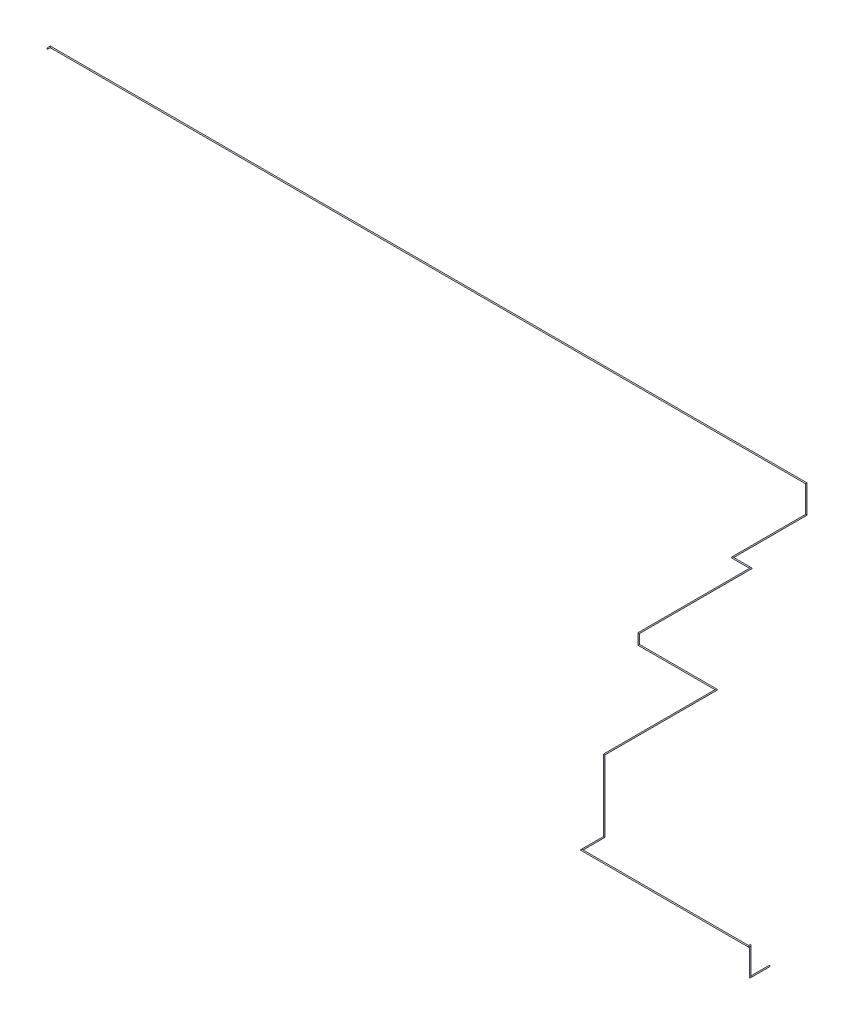
ISO-10303-21;
HEADER;
FILE_DESCRIPTION(('STEP AP214'),'2;1');
FILE_NAME('part.step','',(''),(''),'','','');
FILE_SCHEMA(('AUTOMOTIVE_DESIGN { 1 0 10303 214 1 1 1 1 }'));
ENDSEC;
DATA;
#1=APPLICATION_CONTEXT('core data for automotive mechanical design processes');
#2=APPLICATION_PROTOCOL_DEFINITION('international standard','automotive_design',2000,#1);
#3=PRODUCT_CONTEXT('',#1,'mechanical');
#4=PRODUCT('Part','Part','',(#3));
#5=PRODUCT_RELATED_PRODUCT_CATEGORY('part','',(#4));
#6=PRODUCT_DEFINITION_FORMATION('','',#4);
#7=PRODUCT_DEFINITION_CONTEXT('part definition',#1,'design');
#8=PRODUCT_DEFINITION('design','',#6,#7);
#9=PRODUCT_DEFINITION_SHAPE('','',#8);
#10=(LENGTH_UNIT() NAMED_UNIT(*) SI_UNIT(.MILLI.,.METRE.));
#11=(NAMED_UNIT(*) PLANE_ANGLE_UNIT() SI_UNIT($,.RADIAN.));
#12=(NAMED_UNIT(*) SI_UNIT($,.STERADIAN.) SOLID_ANGLE_UNIT());
#13=UNCERTAINTY_MEASURE_WITH_UNIT(LENGTH_MEASURE(1.E-05),#10,'distance_accuracy_value','');
#14=(GEOMETRIC_REPRESENTATION_CONTEXT(3) GLOBAL_UNCERTAINTY_ASSIGNED_CONTEXT((#13)) GLOBAL_UNIT_ASSIGNED_CONTEXT((#10,
#11,#12)) REPRESENTATION_CONTEXT('',''));
#15=CARTESIAN_POINT('',(0.,0.,0.));
#16=DIRECTION('',(0.,0.,1.));
#17=DIRECTION('',(1.,0.,0.));
#18=AXIS2_PLACEMENT_3D('',#15,#16,#17);
#19=CARTESIAN_POINT('',(0.,0.,10.));
#20=DIRECTION('',(0.,0.,-1.));
#21=DIRECTION('',(-1.,0.,0.));
#22=AXIS2_PLACEMENT_3D('',#19,#20,#21);
#23=CYLINDRICAL_SURFACE('',#22,19.05);
#24=CARTESIAN_POINT('',(0.,0.,0.));
#25=DIRECTION('',(0.,0.,1.));
#26=DIRECTION('',(1.,0.,0.));
#27=AXIS2_PLACEMENT_3D('',#24,#25,#26);
#28=CIRCLE('',#27,19.05);
#29=CARTESIAN_POINT('',(19.049577635223,0.126853930218829,0.));
#30=VERTEX_POINT('',#29);
#31=CARTESIAN_POINT('',(19.049577635223,-0.126853930218829,0.));
#32=VERTEX_POINT('',#31);
#33=EDGE_CURVE('E41',#30,#32,#28,.T.);
#34=ORIENTED_EDGE('',*,*,#33,.T.);
#35=DIRECTION('',(0.,0.,-1.));
#36=VECTOR('',#35,1.);
#37=CARTESIAN_POINT('',(19.049577635223,-0.126853930218829,10.));
#38=LINE('',#37,#36);
#39=CARTESIAN_POINT('',(19.049577635223,-0.126853930218829,0.999999999999999));
#40=VERTEX_POINT('',#39);
#41=EDGE_CURVE('E51',#32,#40,#38,.F.);
#42=ORIENTED_EDGE('',*,*,#41,.T.);
#43=CARTESIAN_POINT('',(0.,0.,0.999999999999999));
#44=DIRECTION('',(0.,0.,1.));
#45=DIRECTION('',(1.,0.,0.));
#46=AXIS2_PLACEMENT_3D('',#43,#44,#45);
#47=CIRCLE('',#46,19.05);
#48=CARTESIAN_POINT('',(19.049577635223,0.126853930218829,0.999999999999999));
#49=VERTEX_POINT('',#48);
#50=EDGE_CURVE('E11',#40,#49,#47,.T.);
#51=ORIENTED_EDGE('',*,*,#50,.T.);
#52=DIRECTION('',(0.,0.,-1.));
#53=VECTOR('',#52,1.);
#54=CARTESIAN_POINT('',(19.049577635223,0.126853930218829,10.));
#55=LINE('',#54,#53);
#56=EDGE_CURVE('E122',#49,#30,#55,.T.);
#57=ORIENTED_EDGE('',*,*,#56,.T.);
#58=EDGE_LOOP('',(#34,#42,#51,#57));
#59=FACE_BOUND('',#58,.T.);
#60=CARTESIAN_POINT('',(0.,0.,660.));
#61=DIRECTION('',(0.,0.707106781186547,0.707106781186547));
#62=DIRECTION('',(0.,-0.707106781186548,0.707106781186548));
#63=AXIS2_PLACEMENT_3D('',#60,#61,#62);
#64=ELLIPSE('',#63,26.9407683632075,19.05);
#65=CARTESIAN_POINT('',(0.,-19.05,679.05));
#66=VERTEX_POINT('',#65);
#67=EDGE_CURVE('E151',#66,#66,#64,.F.);
#68=ORIENTED_EDGE('',*,*,#67,.T.);
#69=EDGE_LOOP('',(#68));
#70=FACE_BOUND('',#69,.T.);
#71=ADVANCED_FACE('F34',(#59,#70),#23,.T.);
#72=CARTESIAN_POINT('',(0.,0.,0.));
#73=DIRECTION('',(0.,0.,1.));
#74=DIRECTION('',(1.,0.,0.));
#75=AXIS2_PLACEMENT_3D('',#72,#73,#74);
#76=PLANE('',#75);
#77=ORIENTED_EDGE('',*,*,#33,.F.);
#78=DIRECTION('',(1.,0.,0.));
#79=VECTOR('',#78,1.);
#80=CARTESIAN_POINT('',(19.1903102147937,0.126853930218829,0.));
#81=LINE('',#80,#79);
#82=CARTESIAN_POINT('',(19.1903102147937,0.126853930218829,0.));
#83=VERTEX_POINT('',#82);
#84=EDGE_CURVE('E142',#30,#83,#81,.T.);
#85=ORIENTED_EDGE('',*,*,#84,.T.);
#86=DIRECTION('',(0.,-1.,0.));
#87=VECTOR('',#86,1.);
#88=CARTESIAN_POINT('',(19.1903102147937,-0.126853930218829,0.));
#89=LINE('',#88,#87);
#90=CARTESIAN_POINT('',(19.1903102147937,-0.126853930218829,0.));
#91=VERTEX_POINT('',#90);
#92=EDGE_CURVE('E133',#83,#91,#89,.T.);
#93=ORIENTED_EDGE('',*,*,#92,.T.);
#94=DIRECTION('',(-1.,0.,0.));
#95=VECTOR('',#94,1.);
#96=CARTESIAN_POINT('',(19.1903102147937,-0.126853930218829,0.));
#97=LINE('',#96,#95);
#98=EDGE_CURVE('E126',#91,#32,#97,.T.);
#99=ORIENTED_EDGE('',*,*,#98,.T.);
#100=EDGE_LOOP('',(#77,#85,#93,#99));
#101=FACE_BOUND('',#100,.T.);
#102=ADVANCED_FACE('F198',(#101),#76,.F.);
#103=CARTESIAN_POINT('',(-35400.,4725.,-10330.));
#104=DIRECTION('',(0.,0.,1.));
#105=DIRECTION('',(1.,0.,0.));
#106=AXIS2_PLACEMENT_3D('',#103,#104,#105);
#107=PLANE('',#106);
#108=CARTESIAN_POINT('',(-35400.,4725.,-10330.));
#109=DIRECTION('',(0.,0.,1.));
#110=DIRECTION('',(1.,0.,0.));
#111=AXIS2_PLACEMENT_3D('',#108,#109,#110);
#112=CIRCLE('',#111,19.05);
#113=CARTESIAN_POINT('',(-35380.95,4725.,-10330.));
#114=VERTEX_POINT('',#113);
#115=EDGE_CURVE('E150',#114,#114,#112,.T.);
#116=ORIENTED_EDGE('',*,*,#115,.T.);
#117=EDGE_LOOP('',(#116));
#118=FACE_BOUND('',#117,.T.);
#119=ADVANCED_FACE('F200',(#118),#107,.T.);
#120=CARTESIAN_POINT('',(-35400.,4725.,-10451.055));
#121=DIRECTION('',(0.,0.,1.));
#122=DIRECTION('',(1.,0.,0.));
#123=AXIS2_PLACEMENT_3D('',#120,#121,#122);
#124=CYLINDRICAL_SURFACE('',#123,19.05);
#125=CARTESIAN_POINT('',(-35400.,4725.,-10430.));
#126=DIRECTION('',(-0.707106781186548,0.,0.707106781186548));
#127=DIRECTION('',(-0.707106781186548,0.,-0.707106781186548));
#128=AXIS2_PLACEMENT_3D('',#125,#126,#127);
#129=ELLIPSE('',#128,26.9407683632075,19.05);
#130=CARTESIAN_POINT('',(-35419.05,4725.,-10449.05));
#131=VERTEX_POINT('',#130);
#132=EDGE_CURVE('E190',#131,#131,#129,.F.);
#133=ORIENTED_EDGE('',*,*,#132,.F.);
#134=EDGE_LOOP('',(#133));
#135=FACE_BOUND('',#134,.T.);
#136=ORIENTED_EDGE('',*,*,#115,.F.);
#137=EDGE_LOOP('',(#136));
#138=FACE_BOUND('',#137,.T.);
#139=ADVANCED_FACE('F206',(#135,#138),#124,.T.);
#140=CARTESIAN_POINT('',(-9107.99,4725.,-10430.));
#141=DIRECTION('',(-1.,0.,0.));
#142=DIRECTION('',(0.,0.,1.));
#143=AXIS2_PLACEMENT_3D('',#140,#141,#142);
#144=CYLINDRICAL_SURFACE('',#143,19.05);
#145=CARTESIAN_POINT('',(-9150.,4725.,-10430.));
#146=DIRECTION('',(-0.707106781186548,0.707106781186548,0.));
#147=DIRECTION('',(0.707106781186548,0.707106781186548,0.));
#148=AXIS2_PLACEMENT_3D('',#145,#146,#147);
#149=ELLIPSE('',#148,26.9407683632075,19.05);
#150=CARTESIAN_POINT('',(-9130.95,4744.05,-10430.));
#151=VERTEX_POINT('',#150);
#152=EDGE_CURVE('E187',#151,#151,#149,.F.);
#153=ORIENTED_EDGE('',*,*,#152,.F.);
#154=EDGE_LOOP('',(#153));
#155=FACE_BOUND('',#154,.T.);
#156=ORIENTED_EDGE('',*,*,#132,.T.);
#157=EDGE_LOOP('',(#156));
#158=FACE_BOUND('',#157,.T.);
#159=ADVANCED_FACE('F263',(#155,#158),#144,.T.);
#160=CARTESIAN_POINT('',(-9150.,3758.945,-10430.));
#161=DIRECTION('',(0.,1.,0.));
#162=DIRECTION('',(0.,0.,1.));
#163=AXIS2_PLACEMENT_3D('',#160,#161,#162);
#164=CYLINDRICAL_SURFACE('',#163,19.05);
#165=CARTESIAN_POINT('',(-9150.,3780.,-10430.));
#166=DIRECTION('',(0.,0.707106781186548,-0.707106781186548));
#167=DIRECTION('',(0.,-0.707106781186548,-0.707106781186548));
#168=AXIS2_PLACEMENT_3D('',#165,#166,#167);
#169=ELLIPSE('',#168,26.9407683632075,19.05);
#170=CARTESIAN_POINT('',(-9150.,3760.95,-10449.05));
#171=VERTEX_POINT('',#170);
#172=EDGE_CURVE('E184',#171,#171,#169,.F.);
#173=ORIENTED_EDGE('',*,*,#172,.F.);
#174=EDGE_LOOP('',(#173));
#175=FACE_BOUND('',#174,.T.);
#176=ORIENTED_EDGE('',*,*,#152,.T.);
#177=EDGE_LOOP('',(#176));
#178=FACE_BOUND('',#177,.T.);
#179=ADVANCED_FACE('F259',(#175,#178),#164,.T.);
#180=CARTESIAN_POINT('',(-9150.,3780.,-7817.99));
#181=DIRECTION('',(0.,0.,-1.));
#182=DIRECTION('',(-1.,0.,0.));
#183=AXIS2_PLACEMENT_3D('',#180,#181,#182);
#184=CYLINDRICAL_SURFACE('',#183,19.05);
#185=CARTESIAN_POINT('',(-9150.,3780.,-7860.));
#186=DIRECTION('',(-0.707106781186548,0.,-0.707106781186548));
#187=DIRECTION('',(-0.707106781186548,0.,0.707106781186548));
#188=AXIS2_PLACEMENT_3D('',#185,#186,#187);
#189=ELLIPSE('',#188,26.9407683632075,19.05);
#190=CARTESIAN_POINT('',(-9169.05,3780.,-7840.95));
#191=VERTEX_POINT('',#190);
#192=EDGE_CURVE('E181',#191,#191,#189,.F.);
#193=ORIENTED_EDGE('',*,*,#192,.F.);
#194=EDGE_LOOP('',(#193));
#195=FACE_BOUND('',#194,.T.);
#196=ORIENTED_EDGE('',*,*,#172,.T.);
#197=EDGE_LOOP('',(#196));
#198=FACE_BOUND('',#197,.T.);
#199=ADVANCED_FACE('F255',(#195,#198),#184,.T.);
#200=CARTESIAN_POINT('',(-8457.99,3780.,-7860.));
#201=DIRECTION('',(-1.,0.,0.));
#202=DIRECTION('',(0.,0.,1.));
#203=AXIS2_PLACEMENT_3D('',#200,#201,#202);
#204=CYLINDRICAL_SURFACE('',#203,19.05);
#205=CARTESIAN_POINT('',(-8500.,3780.,-7860.));
#206=DIRECTION('',(-0.707106781186548,0.,-0.707106781186548));
#207=DIRECTION('',(0.707106781186548,0.,-0.707106781186548));
#208=AXIS2_PLACEMENT_3D('',#205,#206,#207);
#209=ELLIPSE('',#208,26.9407683632075,19.05);
#210=CARTESIAN_POINT('',(-8480.95,3780.,-7879.05));
#211=VERTEX_POINT('',#210);
#212=EDGE_CURVE('E178',#211,#211,#209,.F.);
#213=ORIENTED_EDGE('',*,*,#212,.F.);
#214=EDGE_LOOP('',(#213));
#215=FACE_BOUND('',#214,.T.);
#216=ORIENTED_EDGE('',*,*,#192,.T.);
#217=EDGE_LOOP('',(#216));
#218=FACE_BOUND('',#217,.T.);
#219=ADVANCED_FACE('F251',(#215,#218),#204,.T.);
#220=CARTESIAN_POINT('',(-8500.,3780.,-3938.945));
#221=DIRECTION('',(0.,0.,-1.));
#222=DIRECTION('',(-1.,0.,0.));
#223=AXIS2_PLACEMENT_3D('',#220,#221,#222);
#224=CYLINDRICAL_SURFACE('',#223,19.05);
#225=CARTESIAN_POINT('',(-8500.,3780.,-3960.));
#226=DIRECTION('',(0.,0.707106781186548,-0.707106781186548));
#227=DIRECTION('',(0.,0.707106781186548,0.707106781186548));
#228=AXIS2_PLACEMENT_3D('',#225,#226,#227);
#229=ELLIPSE('',#228,26.9407683632075,19.05);
#230=CARTESIAN_POINT('',(-8500.,3799.05,-3940.95));
#231=VERTEX_POINT('',#230);
#232=EDGE_CURVE('E175',#231,#231,#229,.F.);
#233=ORIENTED_EDGE('',*,*,#232,.F.);
#234=EDGE_LOOP('',(#233));
#235=FACE_BOUND('',#234,.T.);
#236=ORIENTED_EDGE('',*,*,#212,.T.);
#237=EDGE_LOOP('',(#236));
#238=FACE_BOUND('',#237,.T.);
#239=ADVANCED_FACE('F247',(#235,#238),#224,.T.);
#240=CARTESIAN_POINT('',(-8500.,3387.99,-3960.));
#241=DIRECTION('',(0.,1.,0.));
#242=DIRECTION('',(0.,0.,1.));
#243=AXIS2_PLACEMENT_3D('',#240,#241,#242);
#244=CYLINDRICAL_SURFACE('',#243,19.05);
#245=CARTESIAN_POINT('',(-8500.,3430.,-3960.));
#246=DIRECTION('',(-0.707106781186548,0.707106781186548,0.));
#247=DIRECTION('',(-0.707106781186548,-0.707106781186548,0.));
#248=AXIS2_PLACEMENT_3D('',#245,#246,#247);
#249=ELLIPSE('',#248,26.9407683632075,19.05);
#250=CARTESIAN_POINT('',(-8519.05,3410.95,-3960.));
#251=VERTEX_POINT('',#250);
#252=EDGE_CURVE('E172',#251,#251,#249,.F.);
#253=ORIENTED_EDGE('',*,*,#252,.F.);
#254=EDGE_LOOP('',(#253));
#255=FACE_BOUND('',#254,.T.);
#256=ORIENTED_EDGE('',*,*,#232,.T.);
#257=EDGE_LOOP('',(#256));
#258=FACE_BOUND('',#257,.T.);
#259=ADVANCED_FACE('F243',(#255,#258),#244,.T.);
#260=CARTESIAN_POINT('',(-5778.945,3430.,-3960.));
#261=DIRECTION('',(-1.,0.,0.));
#262=DIRECTION('',(0.,0.,1.));
#263=AXIS2_PLACEMENT_3D('',#260,#261,#262);
#264=CYLINDRICAL_SURFACE('',#263,19.05);
#265=CARTESIAN_POINT('',(-5800.,3430.,-3960.));
#266=DIRECTION('',(-0.707106781186548,0.,-0.707106781186548));
#267=DIRECTION('',(0.707106781186548,0.,-0.707106781186548));
#268=AXIS2_PLACEMENT_3D('',#265,#266,#267);
#269=ELLIPSE('',#268,26.9407683632075,19.05);
#270=CARTESIAN_POINT('',(-5780.95,3430.,-3979.05));
#271=VERTEX_POINT('',#270);
#272=EDGE_CURVE('E169',#271,#271,#269,.F.);
#273=ORIENTED_EDGE('',*,*,#272,.F.);
#274=EDGE_LOOP('',(#273));
#275=FACE_BOUND('',#274,.T.);
#276=ORIENTED_EDGE('',*,*,#252,.T.);
#277=EDGE_LOOP('',(#276));
#278=FACE_BOUND('',#277,.T.);
#279=ADVANCED_FACE('F239',(#275,#278),#264,.T.);
#280=CARTESIAN_POINT('',(-5800.,3430.,-17.9900000000001));
#281=DIRECTION('',(0.,0.,-1.));
#282=DIRECTION('',(0.,1.,0.));
#283=AXIS2_PLACEMENT_3D('',#280,#281,#282);
#284=CYLINDRICAL_SURFACE('',#283,19.05);
#285=CARTESIAN_POINT('',(-5800.,3430.,-59.9999999999998));
#286=DIRECTION('',(0.,0.707106781186548,-0.707106781186547));
#287=DIRECTION('',(0.,0.707106781186547,0.707106781186548));
#288=AXIS2_PLACEMENT_3D('',#285,#286,#287);
#289=ELLIPSE('',#288,26.9407683632075,19.05);
#290=CARTESIAN_POINT('',(-5800.,3449.05,-40.9499999999998));
#291=VERTEX_POINT('',#290);
#292=EDGE_CURVE('E166',#291,#291,#289,.F.);
#293=ORIENTED_EDGE('',*,*,#292,.F.);
#294=EDGE_LOOP('',(#293));
#295=FACE_BOUND('',#294,.T.);
#296=ORIENTED_EDGE('',*,*,#272,.T.);
#297=EDGE_LOOP('',(#296));
#298=FACE_BOUND('',#297,.T.);
#299=ADVANCED_FACE('F235',(#295,#298),#284,.T.);
#300=CARTESIAN_POINT('',(-5800.,907.99,-59.9999999999998));
#301=DIRECTION('',(0.,1.,0.));
#302=DIRECTION('',(0.,0.,1.));
#303=AXIS2_PLACEMENT_3D('',#300,#301,#302);
#304=CYLINDRICAL_SURFACE('',#303,19.05);
#305=CARTESIAN_POINT('',(-5800.,950.,-59.9999999999998));
#306=DIRECTION('',(0.,0.707106781186548,-0.707106781186548));
#307=DIRECTION('',(0.,-0.707106781186547,-0.707106781186548));
#308=AXIS2_PLACEMENT_3D('',#305,#306,#307);
#309=ELLIPSE('',#308,26.9407683632075,19.05);
#310=CARTESIAN_POINT('',(-5800.,930.95,-79.0499999999998));
#311=VERTEX_POINT('',#310);
#312=EDGE_CURVE('E163',#311,#311,#309,.F.);
#313=ORIENTED_EDGE('',*,*,#312,.F.);
#314=EDGE_LOOP('',(#313));
#315=FACE_BOUND('',#314,.T.);
#316=ORIENTED_EDGE('',*,*,#292,.T.);
#317=EDGE_LOOP('',(#316));
#318=FACE_BOUND('',#317,.T.);
#319=ADVANCED_FACE('F231',(#315,#318),#304,.T.);
#320=CARTESIAN_POINT('',(-5800.,950.,741.054999999999));
#321=DIRECTION('',(0.,0.,-1.));
#322=DIRECTION('',(0.,1.,0.));
#323=AXIS2_PLACEMENT_3D('',#320,#321,#322);
#324=CYLINDRICAL_SURFACE('',#323,19.05);
#325=CARTESIAN_POINT('',(-5800.,950.,720.));
#326=DIRECTION('',(-0.707106781186547,0.,-0.707106781186547));
#327=DIRECTION('',(-0.707106781186548,0.,0.707106781186548));
#328=AXIS2_PLACEMENT_3D('',#325,#326,#327);
#329=ELLIPSE('',#328,26.9407683632075,19.05);
#330=CARTESIAN_POINT('',(-5819.05,950.,739.05));
#331=VERTEX_POINT('',#330);
#332=EDGE_CURVE('E160',#331,#331,#329,.F.);
#333=ORIENTED_EDGE('',*,*,#332,.F.);
#334=EDGE_LOOP('',(#333));
#335=FACE_BOUND('',#334,.T.);
#336=ORIENTED_EDGE('',*,*,#312,.T.);
#337=EDGE_LOOP('',(#336));
#338=FACE_BOUND('',#337,.T.);
#339=ADVANCED_FACE('F227',(#335,#338),#324,.T.);
#340=CARTESIAN_POINT('',(21.0549999999999,950.,720.));
#341=DIRECTION('',(-1.,0.,0.));
#342=DIRECTION('',(0.,0.,1.));
#343=AXIS2_PLACEMENT_3D('',#340,#341,#342);
#344=CYLINDRICAL_SURFACE('',#343,19.05);
#345=CARTESIAN_POINT('',(0.,950.,720.));
#346=DIRECTION('',(-0.707106781186547,0.,0.707106781186547));
#347=DIRECTION('',(0.707106781186548,0.,0.707106781186548));
#348=AXIS2_PLACEMENT_3D('',#345,#346,#347);
#349=ELLIPSE('',#348,26.9407683632075,19.05);
#350=CARTESIAN_POINT('',(19.05,950.,739.05));
#351=VERTEX_POINT('',#350);
#352=EDGE_CURVE('E157',#351,#351,#349,.F.);
#353=ORIENTED_EDGE('',*,*,#352,.F.);
#354=EDGE_LOOP('',(#353));
#355=FACE_BOUND('',#354,.T.);
#356=ORIENTED_EDGE('',*,*,#332,.T.);
#357=EDGE_LOOP('',(#356));
#358=FACE_BOUND('',#357,.T.);
#359=ADVANCED_FACE('F218',(#355,#358),#344,.T.);
#360=CARTESIAN_POINT('',(0.,950.,617.99));
#361=DIRECTION('',(0.,0.,1.));
#362=DIRECTION('',(1.,0.,0.));
#363=AXIS2_PLACEMENT_3D('',#360,#361,#362);
#364=CYLINDRICAL_SURFACE('',#363,19.05);
#365=CARTESIAN_POINT('',(0.,950.,660.));
#366=DIRECTION('',(0.,0.707106781186548,0.707106781186548));
#367=DIRECTION('',(0.,0.707106781186548,-0.707106781186548));
#368=AXIS2_PLACEMENT_3D('',#365,#366,#367);
#369=ELLIPSE('',#368,26.9407683632075,19.05);
#370=CARTESIAN_POINT('',(0.,969.05,640.95));
#371=VERTEX_POINT('',#370);
#372=EDGE_CURVE('E154',#371,#371,#369,.F.);
#373=ORIENTED_EDGE('',*,*,#372,.F.);
#374=EDGE_LOOP('',(#373));
#375=FACE_BOUND('',#374,.T.);
#376=ORIENTED_EDGE('',*,*,#352,.T.);
#377=EDGE_LOOP('',(#376));
#378=FACE_BOUND('',#377,.T.);
#379=ADVANCED_FACE('F210',(#375,#378),#364,.T.);
#380=CARTESIAN_POINT('',(0.,-42.0099999999999,660.));
#381=DIRECTION('',(0.,1.,0.));
#382=DIRECTION('',(0.,0.,1.));
#383=AXIS2_PLACEMENT_3D('',#380,#381,#382);
#384=CYLINDRICAL_SURFACE('',#383,19.05);
#385=ORIENTED_EDGE('',*,*,#67,.F.);
#386=EDGE_LOOP('',(#385));
#387=FACE_BOUND('',#386,.T.);
#388=ORIENTED_EDGE('',*,*,#372,.T.);
#389=EDGE_LOOP('',(#388));
#390=FACE_BOUND('',#389,.T.);
#391=ADVANCED_FACE('F201',(#387,#390),#384,.T.);
#392=CARTESIAN_POINT('',(19.1903102147937,-0.126853930218829,1.));
#393=DIRECTION('',(0.,-1.,0.));
#394=DIRECTION('',(0.,0.,-1.));
#395=AXIS2_PLACEMENT_3D('',#392,#393,#394);
#396=PLANE('',#395);
#397=ORIENTED_EDGE('',*,*,#41,.F.);
#398=ORIENTED_EDGE('',*,*,#98,.F.);
#399=DIRECTION('',(0.,0.,-1.));
#400=VECTOR('',#399,1.);
#401=CARTESIAN_POINT('',(19.1903102147937,-0.126853930218829,1.));
#402=LINE('',#401,#400);
#403=CARTESIAN_POINT('',(19.1903102147937,-0.126853930218829,1.));
#404=VERTEX_POINT('',#403);
#405=EDGE_CURVE('E134',#404,#91,#402,.T.);
#406=ORIENTED_EDGE('',*,*,#405,.F.);
#407=DIRECTION('',(-1.,0.,0.));
#408=VECTOR('',#407,1.);
#409=CARTESIAN_POINT('',(19.1903102147937,-0.126853930218829,1.));
#410=LINE('',#409,#408);
#411=EDGE_CURVE('E135',#404,#40,#410,.T.);
#412=ORIENTED_EDGE('',*,*,#411,.T.);
#413=EDGE_LOOP('',(#397,#398,#406,#412));
#414=FACE_BOUND('',#413,.T.);
#415=ADVANCED_FACE('F197',(#414),#396,.T.);
#416=CARTESIAN_POINT('',(19.1903102147937,0.126853930218829,1.));
#417=DIRECTION('',(0.,1.,0.));
#418=DIRECTION('',(0.,0.,1.));
#419=AXIS2_PLACEMENT_3D('',#416,#417,#418);
#420=PLANE('',#419);
#421=ORIENTED_EDGE('',*,*,#56,.F.);
#422=DIRECTION('',(1.,0.,0.));
#423=VECTOR('',#422,1.);
#424=CARTESIAN_POINT('',(19.1903102147937,0.126853930218829,1.));
#425=LINE('',#424,#423);
#426=CARTESIAN_POINT('',(19.1903102147937,0.126853930218829,1.));
#427=VERTEX_POINT('',#426);
#428=EDGE_CURVE('E116',#49,#427,#425,.T.);
#429=ORIENTED_EDGE('',*,*,#428,.T.);
#430=DIRECTION('',(0.,0.,-1.));
#431=VECTOR('',#430,1.);
#432=CARTESIAN_POINT('',(19.1903102147937,0.126853930218829,1.));
#433=LINE('',#432,#431);
#434=EDGE_CURVE('E120',#427,#83,#433,.T.);
#435=ORIENTED_EDGE('',*,*,#434,.T.);
#436=ORIENTED_EDGE('',*,*,#84,.F.);
#437=EDGE_LOOP('',(#421,#429,#435,#436));
#438=FACE_BOUND('',#437,.T.);
#439=ADVANCED_FACE('F118',(#438),#420,.T.);
#440=CARTESIAN_POINT('',(19.1903102147937,-0.126853930218829,1.));
#441=DIRECTION('',(1.,0.,0.));
#442=DIRECTION('',(0.,0.,-1.));
#443=AXIS2_PLACEMENT_3D('',#440,#441,#442);
#444=PLANE('',#443);
#445=ORIENTED_EDGE('',*,*,#92,.F.);
#446=ORIENTED_EDGE('',*,*,#434,.F.);
#447=DIRECTION('',(0.,-1.,0.));
#448=VECTOR('',#447,1.);
#449=CARTESIAN_POINT('',(19.1903102147937,-0.126853930218829,1.));
#450=LINE('',#449,#448);
#451=EDGE_CURVE('E125',#427,#404,#450,.T.);
#452=ORIENTED_EDGE('',*,*,#451,.T.);
#453=ORIENTED_EDGE('',*,*,#405,.T.);
#454=EDGE_LOOP('',(#445,#446,#452,#453));
#455=FACE_BOUND('',#454,.T.);
#456=ADVANCED_FACE('F130',(#455),#444,.T.);
#457=CARTESIAN_POINT('',(0.,0.,1.));
#458=DIRECTION('',(0.,0.,1.));
#459=DIRECTION('',(1.,0.,0.));
#460=AXIS2_PLACEMENT_3D('',#457,#458,#459);
#461=PLANE('',#460);
#462=ORIENTED_EDGE('',*,*,#50,.F.);
#463=ORIENTED_EDGE('',*,*,#411,.F.);
#464=ORIENTED_EDGE('',*,*,#451,.F.);
#465=ORIENTED_EDGE('',*,*,#428,.F.);
#466=EDGE_LOOP('',(#462,#463,#464,#465));
#467=FACE_BOUND('',#466,.T.);
#468=ADVANCED_FACE('F137',(#467),#461,.T.);
#469=CLOSED_SHELL('',(#71,#102,#119,#139,#159,#179,#199,#219,#239,#259,#279,#299,#319,#339,#359,
#379,#391,#415,#439,#456,#468));
#470=MANIFOLD_SOLID_BREP('B2',#469);
#471=ADVANCED_BREP_SHAPE_REPRESENTATION('',(#18,#470),#14);
#472=SHAPE_DEFINITION_REPRESENTATION(#9,#471);
ENDSEC;
END-ISO-10303-21;
